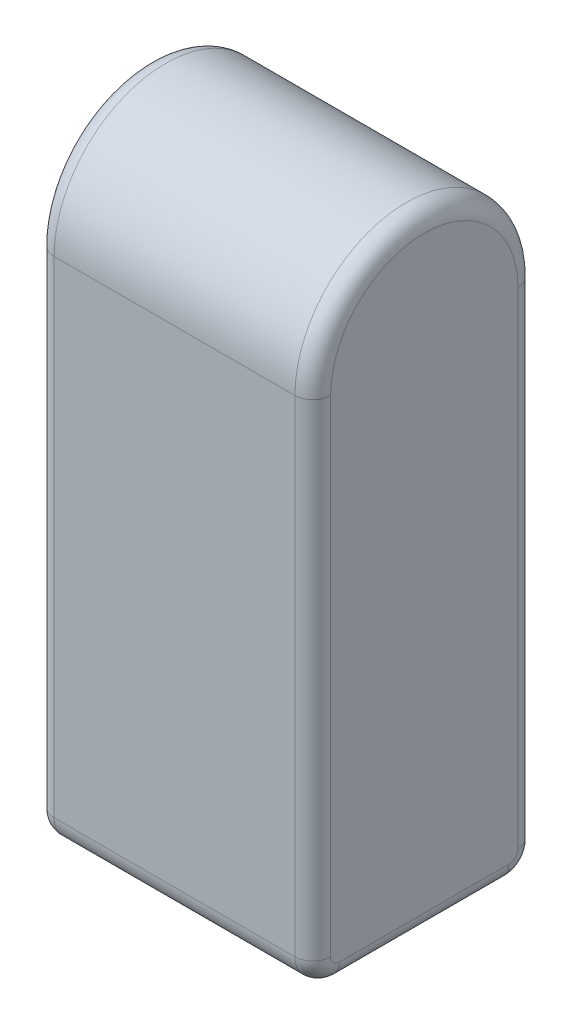
ISO-10303-21;
HEADER;
FILE_DESCRIPTION(('STEP AP214'),'2;1');
FILE_NAME('part.step','',(''),(''),'','','');
FILE_SCHEMA(('AUTOMOTIVE_DESIGN { 1 0 10303 214 1 1 1 1 }'));
ENDSEC;
DATA;
#1=APPLICATION_CONTEXT('core data for automotive mechanical design processes');
#2=APPLICATION_PROTOCOL_DEFINITION('international standard','automotive_design',2000,#1);
#3=PRODUCT_CONTEXT('',#1,'mechanical');
#4=PRODUCT('Part','Part','',(#3));
#5=PRODUCT_RELATED_PRODUCT_CATEGORY('part','',(#4));
#6=PRODUCT_DEFINITION_FORMATION('','',#4);
#7=PRODUCT_DEFINITION_CONTEXT('part definition',#1,'design');
#8=PRODUCT_DEFINITION('design','',#6,#7);
#9=PRODUCT_DEFINITION_SHAPE('','',#8);
#10=(LENGTH_UNIT() NAMED_UNIT(*) SI_UNIT(.MILLI.,.METRE.));
#11=(NAMED_UNIT(*) PLANE_ANGLE_UNIT() SI_UNIT($,.RADIAN.));
#12=(NAMED_UNIT(*) SI_UNIT($,.STERADIAN.) SOLID_ANGLE_UNIT());
#13=UNCERTAINTY_MEASURE_WITH_UNIT(LENGTH_MEASURE(1.E-05),#10,'distance_accuracy_value','');
#14=(GEOMETRIC_REPRESENTATION_CONTEXT(3) GLOBAL_UNCERTAINTY_ASSIGNED_CONTEXT((#13)) GLOBAL_UNIT_ASSIGNED_CONTEXT((#10,
#11,#12)) REPRESENTATION_CONTEXT('',''));
#15=CARTESIAN_POINT('',(0.,0.,0.));
#16=DIRECTION('',(0.,0.,1.));
#17=DIRECTION('',(1.,0.,0.));
#18=AXIS2_PLACEMENT_3D('',#15,#16,#17);
#19=CARTESIAN_POINT('',(15.5,57.5,0.));
#20=DIRECTION('',(-1.,0.,0.));
#21=DIRECTION('',(0.,0.,1.));
#22=AXIS2_PLACEMENT_3D('',#19,#20,#21);
#23=CYLINDRICAL_SURFACE('',#22,12.5);
#24=DIRECTION('',(-1.,0.,0.));
#25=VECTOR('',#24,1.);
#26=CARTESIAN_POINT('',(15.5,57.5,-12.5));
#27=LINE('',#26,#25);
#28=CARTESIAN_POINT('',(13.5,57.5,-12.5));
#29=VERTEX_POINT('',#28);
#30=CARTESIAN_POINT('',(-13.5,57.5,-12.5));
#31=VERTEX_POINT('',#30);
#32=EDGE_CURVE('E156',#29,#31,#27,.T.);
#33=ORIENTED_EDGE('',*,*,#32,.T.);
#34=CARTESIAN_POINT('',(-13.5,57.5,0.));
#35=DIRECTION('',(-1.,0.,0.));
#36=DIRECTION('',(0.,0.,1.));
#37=AXIS2_PLACEMENT_3D('',#34,#35,#36);
#38=CIRCLE('',#37,12.5);
#39=CARTESIAN_POINT('',(-13.5,57.5,12.5));
#40=VERTEX_POINT('',#39);
#41=EDGE_CURVE('E153',#31,#40,#38,.F.);
#42=ORIENTED_EDGE('',*,*,#41,.T.);
#43=DIRECTION('',(-1.,0.,0.));
#44=VECTOR('',#43,1.);
#45=CARTESIAN_POINT('',(15.5,57.5,12.5));
#46=LINE('',#45,#44);
#47=CARTESIAN_POINT('',(13.5,57.5,12.5));
#48=VERTEX_POINT('',#47);
#49=EDGE_CURVE('E135',#48,#40,#46,.T.);
#50=ORIENTED_EDGE('',*,*,#49,.F.);
#51=CARTESIAN_POINT('',(13.5,57.5,0.));
#52=DIRECTION('',(-1.,0.,0.));
#53=DIRECTION('',(0.,0.,1.));
#54=AXIS2_PLACEMENT_3D('',#51,#52,#53);
#55=CIRCLE('',#54,12.5);
#56=EDGE_CURVE('E150',#48,#29,#55,.T.);
#57=ORIENTED_EDGE('',*,*,#56,.T.);
#58=EDGE_LOOP('',(#33,#42,#50,#57));
#59=FACE_BOUND('',#58,.T.);
#60=ADVANCED_FACE('F41',(#59),#23,.T.);
#61=CARTESIAN_POINT('',(15.5,57.5,12.5));
#62=DIRECTION('',(0.,0.,-1.));
#63=DIRECTION('',(0.,1.,0.));
#64=AXIS2_PLACEMENT_3D('',#61,#62,#63);
#65=PLANE('',#64);
#66=ORIENTED_EDGE('',*,*,#49,.T.);
#67=DIRECTION('',(0.,-1.,0.));
#68=VECTOR('',#67,1.);
#69=CARTESIAN_POINT('',(-13.5,3.,12.5));
#70=LINE('',#69,#68);
#71=CARTESIAN_POINT('',(-13.5,3.,12.5));
#72=VERTEX_POINT('',#71);
#73=EDGE_CURVE('E11',#40,#72,#70,.T.);
#74=ORIENTED_EDGE('',*,*,#73,.T.);
#75=DIRECTION('',(-1.,0.,0.));
#76=VECTOR('',#75,1.);
#77=CARTESIAN_POINT('',(15.5,3.,12.5));
#78=LINE('',#77,#76);
#79=CARTESIAN_POINT('',(13.5,3.,12.5));
#80=VERTEX_POINT('',#79);
#81=EDGE_CURVE('E137',#72,#80,#78,.F.);
#82=ORIENTED_EDGE('',*,*,#81,.T.);
#83=DIRECTION('',(0.,-1.,0.));
#84=VECTOR('',#83,1.);
#85=CARTESIAN_POINT('',(13.5,57.5,12.5));
#86=LINE('',#85,#84);
#87=EDGE_CURVE('E51',#80,#48,#86,.F.);
#88=ORIENTED_EDGE('',*,*,#87,.T.);
#89=EDGE_LOOP('',(#66,#74,#82,#88));
#90=FACE_BOUND('',#89,.T.);
#91=ADVANCED_FACE('F134',(#90),#65,.F.);
#92=CARTESIAN_POINT('',(15.5,0.,12.5));
#93=DIRECTION('',(0.,1.,0.));
#94=DIRECTION('',(0.,0.,1.));
#95=AXIS2_PLACEMENT_3D('',#92,#93,#94);
#96=PLANE('',#95);
#97=DIRECTION('',(-1.,0.,0.));
#98=VECTOR('',#97,1.);
#99=CARTESIAN_POINT('',(15.5,0.,9.5));
#100=LINE('',#99,#98);
#101=CARTESIAN_POINT('',(13.5,0.,9.5));
#102=VERTEX_POINT('',#101);
#103=CARTESIAN_POINT('',(-13.5,0.,9.5));
#104=VERTEX_POINT('',#103);
#105=EDGE_CURVE('E233',#102,#104,#100,.T.);
#106=ORIENTED_EDGE('',*,*,#105,.T.);
#107=DIRECTION('',(0.,0.,-1.));
#108=VECTOR('',#107,1.);
#109=CARTESIAN_POINT('',(-13.5,0.,-9.5));
#110=LINE('',#109,#108);
#111=CARTESIAN_POINT('',(-13.5,0.,-9.5));
#112=VERTEX_POINT('',#111);
#113=EDGE_CURVE('E279',#104,#112,#110,.T.);
#114=ORIENTED_EDGE('',*,*,#113,.T.);
#115=DIRECTION('',(-1.,0.,0.));
#116=VECTOR('',#115,1.);
#117=CARTESIAN_POINT('',(15.5,0.,-9.5));
#118=LINE('',#117,#116);
#119=CARTESIAN_POINT('',(13.5,0.,-9.5));
#120=VERTEX_POINT('',#119);
#121=EDGE_CURVE('E237',#112,#120,#118,.F.);
#122=ORIENTED_EDGE('',*,*,#121,.T.);
#123=DIRECTION('',(0.,0.,-1.));
#124=VECTOR('',#123,1.);
#125=CARTESIAN_POINT('',(13.5,0.,12.5));
#126=LINE('',#125,#124);
#127=EDGE_CURVE('E276',#120,#102,#126,.F.);
#128=ORIENTED_EDGE('',*,*,#127,.T.);
#129=EDGE_LOOP('',(#106,#114,#122,#128));
#130=FACE_BOUND('',#129,.T.);
#131=ADVANCED_FACE('F342',(#130),#96,.F.);
#132=CARTESIAN_POINT('',(15.5,0.,-12.5));
#133=DIRECTION('',(0.,0.,1.));
#134=DIRECTION('',(0.,-1.,0.));
#135=AXIS2_PLACEMENT_3D('',#132,#133,#134);
#136=PLANE('',#135);
#137=DIRECTION('',(-1.,0.,0.));
#138=VECTOR('',#137,1.);
#139=CARTESIAN_POINT('',(15.5,3.,-12.5));
#140=LINE('',#139,#138);
#141=CARTESIAN_POINT('',(13.5,3.,-12.5));
#142=VERTEX_POINT('',#141);
#143=CARTESIAN_POINT('',(-13.5,3.,-12.5));
#144=VERTEX_POINT('',#143);
#145=EDGE_CURVE('E155',#142,#144,#140,.T.);
#146=ORIENTED_EDGE('',*,*,#145,.T.);
#147=DIRECTION('',(0.,1.,0.));
#148=VECTOR('',#147,1.);
#149=CARTESIAN_POINT('',(-13.5,57.5,-12.5));
#150=LINE('',#149,#148);
#151=EDGE_CURVE('E267',#144,#31,#150,.T.);
#152=ORIENTED_EDGE('',*,*,#151,.T.);
#153=ORIENTED_EDGE('',*,*,#32,.F.);
#154=DIRECTION('',(0.,1.,0.));
#155=VECTOR('',#154,1.);
#156=CARTESIAN_POINT('',(13.5,0.,-12.5));
#157=LINE('',#156,#155);
#158=EDGE_CURVE('E264',#29,#142,#157,.F.);
#159=ORIENTED_EDGE('',*,*,#158,.T.);
#160=EDGE_LOOP('',(#146,#152,#153,#159));
#161=FACE_BOUND('',#160,.T.);
#162=ADVANCED_FACE('F316',(#161),#136,.F.);
#163=CARTESIAN_POINT('',(15.5,57.5,0.));
#164=DIRECTION('',(-1.,0.,0.));
#165=DIRECTION('',(0.,0.,1.));
#166=AXIS2_PLACEMENT_3D('',#163,#164,#165);
#167=PLANE('',#166);
#168=DIRECTION('',(0.,1.,0.));
#169=VECTOR('',#168,1.);
#170=CARTESIAN_POINT('',(15.5,57.5,-10.5));
#171=LINE('',#170,#169);
#172=CARTESIAN_POINT('',(15.5,3.,-10.5));
#173=VERTEX_POINT('',#172);
#174=CARTESIAN_POINT('',(15.5,57.5,-10.5));
#175=VERTEX_POINT('',#174);
#176=EDGE_CURVE('E59',#173,#175,#171,.T.);
#177=ORIENTED_EDGE('',*,*,#176,.T.);
#178=CARTESIAN_POINT('',(15.5,57.5,0.));
#179=DIRECTION('',(-1.,0.,0.));
#180=DIRECTION('',(0.,0.,1.));
#181=AXIS2_PLACEMENT_3D('',#178,#179,#180);
#182=CIRCLE('',#181,10.5);
#183=CARTESIAN_POINT('',(15.5,57.5,10.5));
#184=VERTEX_POINT('',#183);
#185=EDGE_CURVE('E143',#175,#184,#182,.F.);
#186=ORIENTED_EDGE('',*,*,#185,.T.);
#187=DIRECTION('',(0.,-1.,0.));
#188=VECTOR('',#187,1.);
#189=CARTESIAN_POINT('',(15.5,57.5,10.5));
#190=LINE('',#189,#188);
#191=CARTESIAN_POINT('',(15.5,3.,10.5));
#192=VERTEX_POINT('',#191);
#193=EDGE_CURVE('E168',#184,#192,#190,.T.);
#194=ORIENTED_EDGE('',*,*,#193,.T.);
#195=CARTESIAN_POINT('',(15.5,3.,9.5));
#196=DIRECTION('',(-1.,0.,0.));
#197=DIRECTION('',(0.,0.,1.));
#198=AXIS2_PLACEMENT_3D('',#195,#196,#197);
#199=CIRCLE('',#198,1.);
#200=CARTESIAN_POINT('',(15.5,2.,9.5));
#201=VERTEX_POINT('',#200);
#202=EDGE_CURVE('E290',#192,#201,#199,.F.);
#203=ORIENTED_EDGE('',*,*,#202,.T.);
#204=DIRECTION('',(0.,0.,-1.));
#205=VECTOR('',#204,1.);
#206=CARTESIAN_POINT('',(15.5,2.,0.));
#207=LINE('',#206,#205);
#208=CARTESIAN_POINT('',(15.5,2.,-9.5));
#209=VERTEX_POINT('',#208);
#210=EDGE_CURVE('E293',#201,#209,#207,.T.);
#211=ORIENTED_EDGE('',*,*,#210,.T.);
#212=CARTESIAN_POINT('',(15.5,3.,-9.5));
#213=DIRECTION('',(-1.,0.,0.));
#214=DIRECTION('',(0.,0.,1.));
#215=AXIS2_PLACEMENT_3D('',#212,#213,#214);
#216=CIRCLE('',#215,1.);
#217=EDGE_CURVE('E64',#209,#173,#216,.F.);
#218=ORIENTED_EDGE('',*,*,#217,.T.);
#219=EDGE_LOOP('',(#177,#186,#194,#203,#211,#218));
#220=FACE_BOUND('',#219,.T.);
#221=ADVANCED_FACE('F301',(#220),#167,.F.);
#222=CARTESIAN_POINT('',(-15.5,57.5,0.));
#223=DIRECTION('',(-1.,0.,0.));
#224=DIRECTION('',(0.,0.,1.));
#225=AXIS2_PLACEMENT_3D('',#222,#223,#224);
#226=PLANE('',#225);
#227=DIRECTION('',(0.,-1.,0.));
#228=VECTOR('',#227,1.);
#229=CARTESIAN_POINT('',(-15.5,57.5,10.5));
#230=LINE('',#229,#228);
#231=CARTESIAN_POINT('',(-15.5,3.,10.5));
#232=VERTEX_POINT('',#231);
#233=CARTESIAN_POINT('',(-15.5,57.5,10.5));
#234=VERTEX_POINT('',#233);
#235=EDGE_CURVE('E245',#232,#234,#230,.F.);
#236=ORIENTED_EDGE('',*,*,#235,.T.);
#237=CARTESIAN_POINT('',(-15.5,57.5,0.));
#238=DIRECTION('',(-1.,0.,0.));
#239=DIRECTION('',(0.,0.,1.));
#240=AXIS2_PLACEMENT_3D('',#237,#238,#239);
#241=CIRCLE('',#240,10.5);
#242=CARTESIAN_POINT('',(-15.5,57.5,-10.5));
#243=VERTEX_POINT('',#242);
#244=EDGE_CURVE('E260',#234,#243,#241,.T.);
#245=ORIENTED_EDGE('',*,*,#244,.T.);
#246=DIRECTION('',(0.,1.,0.));
#247=VECTOR('',#246,1.);
#248=CARTESIAN_POINT('',(-15.5,3.,-10.5));
#249=LINE('',#248,#247);
#250=CARTESIAN_POINT('',(-15.5,3.,-10.5));
#251=VERTEX_POINT('',#250);
#252=EDGE_CURVE('E257',#243,#251,#249,.F.);
#253=ORIENTED_EDGE('',*,*,#252,.T.);
#254=CARTESIAN_POINT('',(-15.5,3.,-9.5));
#255=DIRECTION('',(-1.,0.,0.));
#256=DIRECTION('',(0.,0.,1.));
#257=AXIS2_PLACEMENT_3D('',#254,#255,#256);
#258=CIRCLE('',#257,1.);
#259=CARTESIAN_POINT('',(-15.5,2.,-9.5));
#260=VERTEX_POINT('',#259);
#261=EDGE_CURVE('E254',#251,#260,#258,.T.);
#262=ORIENTED_EDGE('',*,*,#261,.T.);
#263=DIRECTION('',(0.,0.,-1.));
#264=VECTOR('',#263,1.);
#265=CARTESIAN_POINT('',(-15.5,2.,9.5));
#266=LINE('',#265,#264);
#267=CARTESIAN_POINT('',(-15.5,2.,9.5));
#268=VERTEX_POINT('',#267);
#269=EDGE_CURVE('E251',#260,#268,#266,.F.);
#270=ORIENTED_EDGE('',*,*,#269,.T.);
#271=CARTESIAN_POINT('',(-15.5,3.,9.5));
#272=DIRECTION('',(-1.,0.,0.));
#273=DIRECTION('',(0.,0.,1.));
#274=AXIS2_PLACEMENT_3D('',#271,#272,#273);
#275=CIRCLE('',#274,1.);
#276=EDGE_CURVE('E248',#268,#232,#275,.T.);
#277=ORIENTED_EDGE('',*,*,#276,.T.);
#278=EDGE_LOOP('',(#236,#245,#253,#262,#270,#277));
#279=FACE_BOUND('',#278,.T.);
#280=ADVANCED_FACE('F347',(#279),#226,.T.);
#281=CARTESIAN_POINT('',(15.5,3.,-9.5));
#282=DIRECTION('',(-1.,0.,0.));
#283=DIRECTION('',(0.,0.,1.));
#284=AXIS2_PLACEMENT_3D('',#281,#282,#283);
#285=CYLINDRICAL_SURFACE('',#284,3.);
#286=ORIENTED_EDGE('',*,*,#121,.F.);
#287=CARTESIAN_POINT('',(-13.5,3.,-9.5));
#288=DIRECTION('',(-1.,0.,0.));
#289=DIRECTION('',(0.,0.,1.));
#290=AXIS2_PLACEMENT_3D('',#287,#288,#289);
#291=CIRCLE('',#290,3.);
#292=EDGE_CURVE('E273',#112,#144,#291,.F.);
#293=ORIENTED_EDGE('',*,*,#292,.T.);
#294=ORIENTED_EDGE('',*,*,#145,.F.);
#295=CARTESIAN_POINT('',(13.5,3.,-9.5));
#296=DIRECTION('',(-1.,0.,0.));
#297=DIRECTION('',(0.,0.,1.));
#298=AXIS2_PLACEMENT_3D('',#295,#296,#297);
#299=CIRCLE('',#298,3.);
#300=EDGE_CURVE('E270',#142,#120,#299,.T.);
#301=ORIENTED_EDGE('',*,*,#300,.T.);
#302=EDGE_LOOP('',(#286,#293,#294,#301));
#303=FACE_BOUND('',#302,.T.);
#304=ADVANCED_FACE('F320',(#303),#285,.T.);
#305=CARTESIAN_POINT('',(15.5,3.,9.5));
#306=DIRECTION('',(-1.,0.,0.));
#307=DIRECTION('',(0.,0.,1.));
#308=AXIS2_PLACEMENT_3D('',#305,#306,#307);
#309=CYLINDRICAL_SURFACE('',#308,3.);
#310=ORIENTED_EDGE('',*,*,#81,.F.);
#311=CARTESIAN_POINT('',(-13.5,3.,9.5));
#312=DIRECTION('',(-1.,0.,0.));
#313=DIRECTION('',(0.,0.,1.));
#314=AXIS2_PLACEMENT_3D('',#311,#312,#313);
#315=CIRCLE('',#314,3.);
#316=EDGE_CURVE('E285',#72,#104,#315,.F.);
#317=ORIENTED_EDGE('',*,*,#316,.T.);
#318=ORIENTED_EDGE('',*,*,#105,.F.);
#319=CARTESIAN_POINT('',(13.5,3.,9.5));
#320=DIRECTION('',(-1.,0.,0.));
#321=DIRECTION('',(0.,0.,1.));
#322=AXIS2_PLACEMENT_3D('',#319,#320,#321);
#323=CIRCLE('',#322,3.);
#324=EDGE_CURVE('E282',#102,#80,#323,.T.);
#325=ORIENTED_EDGE('',*,*,#324,.T.);
#326=EDGE_LOOP('',(#310,#317,#318,#325));
#327=FACE_BOUND('',#326,.T.);
#328=ADVANCED_FACE('F306',(#327),#309,.T.);
#329=CARTESIAN_POINT('',(-13.5,2.,12.5));
#330=DIRECTION('',(0.,0.,1.));
#331=DIRECTION('',(0.,-1.,0.));
#332=AXIS2_PLACEMENT_3D('',#329,#330,#331);
#333=CYLINDRICAL_SURFACE('',#332,2.);
#334=CARTESIAN_POINT('',(-13.5,2.,9.5));
#335=DIRECTION('',(0.,0.,1.));
#336=DIRECTION('',(1.,0.,0.));
#337=AXIS2_PLACEMENT_3D('',#334,#335,#336);
#338=CIRCLE('',#337,2.);
#339=EDGE_CURVE('E213',#268,#104,#338,.T.);
#340=ORIENTED_EDGE('',*,*,#339,.F.);
#341=ORIENTED_EDGE('',*,*,#269,.F.);
#342=CARTESIAN_POINT('',(-13.5,2.,-9.5));
#343=DIRECTION('',(0.,0.,-1.));
#344=DIRECTION('',(-1.,0.,0.));
#345=AXIS2_PLACEMENT_3D('',#342,#343,#344);
#346=CIRCLE('',#345,2.);
#347=EDGE_CURVE('E175',#112,#260,#346,.T.);
#348=ORIENTED_EDGE('',*,*,#347,.F.);
#349=ORIENTED_EDGE('',*,*,#113,.F.);
#350=EDGE_LOOP('',(#340,#341,#348,#349));
#351=FACE_BOUND('',#350,.T.);
#352=ADVANCED_FACE('F349',(#351),#333,.T.);
#353=CARTESIAN_POINT('',(-13.5,3.,-9.5));
#354=DIRECTION('',(-1.,0.,0.));
#355=DIRECTION('',(0.,0.,1.));
#356=AXIS2_PLACEMENT_3D('',#353,#354,#355);
#357=DEGENERATE_TOROIDAL_SURFACE('',#356,1.,2.,.T.);
#358=ORIENTED_EDGE('',*,*,#347,.T.);
#359=ORIENTED_EDGE('',*,*,#261,.F.);
#360=CARTESIAN_POINT('',(-13.5,3.,-10.5));
#361=DIRECTION('',(0.,1.,0.));
#362=DIRECTION('',(0.,0.,1.));
#363=AXIS2_PLACEMENT_3D('',#360,#361,#362);
#364=CIRCLE('',#363,2.);
#365=EDGE_CURVE('E210',#144,#251,#364,.T.);
#366=ORIENTED_EDGE('',*,*,#365,.F.);
#367=ORIENTED_EDGE('',*,*,#292,.F.);
#368=EDGE_LOOP('',(#358,#359,#366,#367));
#369=FACE_BOUND('',#368,.T.);
#370=ADVANCED_FACE('F321',(#369),#357,.T.);
#371=CARTESIAN_POINT('',(-13.5,3.,9.5));
#372=DIRECTION('',(-1.,0.,0.));
#373=DIRECTION('',(0.,0.,1.));
#374=AXIS2_PLACEMENT_3D('',#371,#372,#373);
#375=DEGENERATE_TOROIDAL_SURFACE('',#374,1.,2.,.T.);
#376=ORIENTED_EDGE('',*,*,#339,.T.);
#377=ORIENTED_EDGE('',*,*,#316,.F.);
#378=CARTESIAN_POINT('',(-13.5,3.,10.5));
#379=DIRECTION('',(0.,1.,0.));
#380=DIRECTION('',(0.,0.,1.));
#381=AXIS2_PLACEMENT_3D('',#378,#379,#380);
#382=CIRCLE('',#381,2.);
#383=EDGE_CURVE('E204',#232,#72,#382,.T.);
#384=ORIENTED_EDGE('',*,*,#383,.F.);
#385=ORIENTED_EDGE('',*,*,#276,.F.);
#386=EDGE_LOOP('',(#376,#377,#384,#385));
#387=FACE_BOUND('',#386,.T.);
#388=ADVANCED_FACE('F358',(#387),#375,.T.);
#389=CARTESIAN_POINT('',(-13.5,0.,-10.5));
#390=DIRECTION('',(0.,-1.,0.));
#391=DIRECTION('',(0.,0.,-1.));
#392=AXIS2_PLACEMENT_3D('',#389,#390,#391);
#393=CYLINDRICAL_SURFACE('',#392,2.);
#394=ORIENTED_EDGE('',*,*,#365,.T.);
#395=ORIENTED_EDGE('',*,*,#252,.F.);
#396=CARTESIAN_POINT('',(-13.5,57.5,-10.5));
#397=DIRECTION('',(0.,1.,0.));
#398=DIRECTION('',(0.,0.,1.));
#399=AXIS2_PLACEMENT_3D('',#396,#397,#398);
#400=CIRCLE('',#399,2.);
#401=EDGE_CURVE('E197',#31,#243,#400,.T.);
#402=ORIENTED_EDGE('',*,*,#401,.F.);
#403=ORIENTED_EDGE('',*,*,#151,.F.);
#404=EDGE_LOOP('',(#394,#395,#402,#403));
#405=FACE_BOUND('',#404,.T.);
#406=ADVANCED_FACE('F325',(#405),#393,.T.);
#407=CARTESIAN_POINT('',(-13.5,57.5,10.5));
#408=DIRECTION('',(0.,1.,0.));
#409=DIRECTION('',(0.,0.,1.));
#410=AXIS2_PLACEMENT_3D('',#407,#408,#409);
#411=CYLINDRICAL_SURFACE('',#410,2.);
#412=ORIENTED_EDGE('',*,*,#383,.T.);
#413=ORIENTED_EDGE('',*,*,#73,.F.);
#414=CARTESIAN_POINT('',(-13.5,57.5,10.5));
#415=DIRECTION('',(0.,1.,0.));
#416=DIRECTION('',(0.,0.,1.));
#417=AXIS2_PLACEMENT_3D('',#414,#415,#416);
#418=CIRCLE('',#417,2.);
#419=EDGE_CURVE('E192',#234,#40,#418,.T.);
#420=ORIENTED_EDGE('',*,*,#419,.F.);
#421=ORIENTED_EDGE('',*,*,#235,.F.);
#422=EDGE_LOOP('',(#412,#413,#420,#421));
#423=FACE_BOUND('',#422,.T.);
#424=ADVANCED_FACE('F328',(#423),#411,.T.);
#425=CARTESIAN_POINT('',(-13.5,57.5,0.));
#426=DIRECTION('',(-1.,0.,0.));
#427=DIRECTION('',(0.,0.,1.));
#428=AXIS2_PLACEMENT_3D('',#425,#426,#427);
#429=TOROIDAL_SURFACE('',#428,10.5,2.);
#430=ORIENTED_EDGE('',*,*,#401,.T.);
#431=ORIENTED_EDGE('',*,*,#244,.F.);
#432=ORIENTED_EDGE('',*,*,#419,.T.);
#433=ORIENTED_EDGE('',*,*,#41,.F.);
#434=EDGE_LOOP('',(#430,#431,#432,#433));
#435=FACE_BOUND('',#434,.T.);
#436=ADVANCED_FACE('F326',(#435),#429,.T.);
#437=CARTESIAN_POINT('',(13.5,2.,0.));
#438=DIRECTION('',(0.,0.,-1.));
#439=DIRECTION('',(0.,1.,0.));
#440=AXIS2_PLACEMENT_3D('',#437,#438,#439);
#441=CYLINDRICAL_SURFACE('',#440,2.);
#442=CARTESIAN_POINT('',(13.5,2.,9.5));
#443=DIRECTION('',(0.,0.,1.));
#444=DIRECTION('',(1.,0.,0.));
#445=AXIS2_PLACEMENT_3D('',#442,#443,#444);
#446=CIRCLE('',#445,2.);
#447=EDGE_CURVE('E183',#102,#201,#446,.T.);
#448=ORIENTED_EDGE('',*,*,#447,.F.);
#449=ORIENTED_EDGE('',*,*,#127,.F.);
#450=CARTESIAN_POINT('',(13.5,2.,-9.5));
#451=DIRECTION('',(0.,0.,-1.));
#452=DIRECTION('',(0.,1.,0.));
#453=AXIS2_PLACEMENT_3D('',#450,#451,#452);
#454=CIRCLE('',#453,2.);
#455=EDGE_CURVE('E45',#209,#120,#454,.T.);
#456=ORIENTED_EDGE('',*,*,#455,.F.);
#457=ORIENTED_EDGE('',*,*,#210,.F.);
#458=EDGE_LOOP('',(#448,#449,#456,#457));
#459=FACE_BOUND('',#458,.T.);
#460=ADVANCED_FACE('F43',(#459),#441,.T.);
#461=CARTESIAN_POINT('',(13.5,3.,-9.5));
#462=DIRECTION('',(-1.,0.,0.));
#463=DIRECTION('',(0.,0.,1.));
#464=AXIS2_PLACEMENT_3D('',#461,#462,#463);
#465=DEGENERATE_TOROIDAL_SURFACE('',#464,1.,2.,.T.);
#466=ORIENTED_EDGE('',*,*,#455,.T.);
#467=ORIENTED_EDGE('',*,*,#300,.F.);
#468=CARTESIAN_POINT('',(13.5,3.,-10.5));
#469=DIRECTION('',(0.,1.,0.));
#470=DIRECTION('',(0.,0.,1.));
#471=AXIS2_PLACEMENT_3D('',#468,#469,#470);
#472=CIRCLE('',#471,2.);
#473=EDGE_CURVE('E180',#173,#142,#472,.T.);
#474=ORIENTED_EDGE('',*,*,#473,.F.);
#475=ORIENTED_EDGE('',*,*,#217,.F.);
#476=EDGE_LOOP('',(#466,#467,#474,#475));
#477=FACE_BOUND('',#476,.T.);
#478=ADVANCED_FACE('F311',(#477),#465,.T.);
#479=CARTESIAN_POINT('',(13.5,3.,9.5));
#480=DIRECTION('',(-1.,0.,0.));
#481=DIRECTION('',(0.,0.,1.));
#482=AXIS2_PLACEMENT_3D('',#479,#480,#481);
#483=DEGENERATE_TOROIDAL_SURFACE('',#482,1.,2.,.T.);
#484=ORIENTED_EDGE('',*,*,#447,.T.);
#485=ORIENTED_EDGE('',*,*,#202,.F.);
#486=CARTESIAN_POINT('',(13.5,3.,10.5));
#487=DIRECTION('',(0.,1.,0.));
#488=DIRECTION('',(0.,0.,1.));
#489=AXIS2_PLACEMENT_3D('',#486,#487,#488);
#490=CIRCLE('',#489,2.);
#491=EDGE_CURVE('E172',#80,#192,#490,.T.);
#492=ORIENTED_EDGE('',*,*,#491,.F.);
#493=ORIENTED_EDGE('',*,*,#324,.F.);
#494=EDGE_LOOP('',(#484,#485,#492,#493));
#495=FACE_BOUND('',#494,.T.);
#496=ADVANCED_FACE('F303',(#495),#483,.T.);
#497=CARTESIAN_POINT('',(13.5,57.5,-10.5));
#498=DIRECTION('',(0.,1.,0.));
#499=DIRECTION('',(0.,0.,1.));
#500=AXIS2_PLACEMENT_3D('',#497,#498,#499);
#501=CYLINDRICAL_SURFACE('',#500,2.);
#502=ORIENTED_EDGE('',*,*,#473,.T.);
#503=ORIENTED_EDGE('',*,*,#158,.F.);
#504=CARTESIAN_POINT('',(13.5,57.5,-10.5));
#505=DIRECTION('',(0.,1.,0.));
#506=DIRECTION('',(0.,0.,1.));
#507=AXIS2_PLACEMENT_3D('',#504,#505,#506);
#508=CIRCLE('',#507,2.);
#509=EDGE_CURVE('E163',#175,#29,#508,.T.);
#510=ORIENTED_EDGE('',*,*,#509,.F.);
#511=ORIENTED_EDGE('',*,*,#176,.F.);
#512=EDGE_LOOP('',(#502,#503,#510,#511));
#513=FACE_BOUND('',#512,.T.);
#514=ADVANCED_FACE('F313',(#513),#501,.T.);
#515=CARTESIAN_POINT('',(13.5,57.5,10.5));
#516=DIRECTION('',(0.,-1.,0.));
#517=DIRECTION('',(0.,0.,-1.));
#518=AXIS2_PLACEMENT_3D('',#515,#516,#517);
#519=CYLINDRICAL_SURFACE('',#518,2.);
#520=ORIENTED_EDGE('',*,*,#491,.T.);
#521=ORIENTED_EDGE('',*,*,#193,.F.);
#522=CARTESIAN_POINT('',(13.5,57.5,10.5));
#523=DIRECTION('',(0.,1.,0.));
#524=DIRECTION('',(0.,0.,1.));
#525=AXIS2_PLACEMENT_3D('',#522,#523,#524);
#526=CIRCLE('',#525,2.);
#527=EDGE_CURVE('E161',#48,#184,#526,.T.);
#528=ORIENTED_EDGE('',*,*,#527,.F.);
#529=ORIENTED_EDGE('',*,*,#87,.F.);
#530=EDGE_LOOP('',(#520,#521,#528,#529));
#531=FACE_BOUND('',#530,.T.);
#532=ADVANCED_FACE('F167',(#531),#519,.T.);
#533=CARTESIAN_POINT('',(13.5,57.5,0.));
#534=DIRECTION('',(-1.,0.,0.));
#535=DIRECTION('',(0.,0.,1.));
#536=AXIS2_PLACEMENT_3D('',#533,#534,#535);
#537=TOROIDAL_SURFACE('',#536,10.5,2.);
#538=ORIENTED_EDGE('',*,*,#509,.T.);
#539=ORIENTED_EDGE('',*,*,#56,.F.);
#540=ORIENTED_EDGE('',*,*,#527,.T.);
#541=ORIENTED_EDGE('',*,*,#185,.F.);
#542=EDGE_LOOP('',(#538,#539,#540,#541));
#543=FACE_BOUND('',#542,.T.);
#544=ADVANCED_FACE('F159',(#543),#537,.T.);
#545=CLOSED_SHELL('',(#60,#91,#131,#162,#221,#280,#304,#328,#352,#370,#388,#406,#424,#436,#460,
#478,#496,#514,#532,#544));
#546=MANIFOLD_SOLID_BREP('B2',#545);
#547=ADVANCED_BREP_SHAPE_REPRESENTATION('',(#18,#546),#14);
#548=SHAPE_DEFINITION_REPRESENTATION(#9,#547);
ENDSEC;
END-ISO-10303-21;
